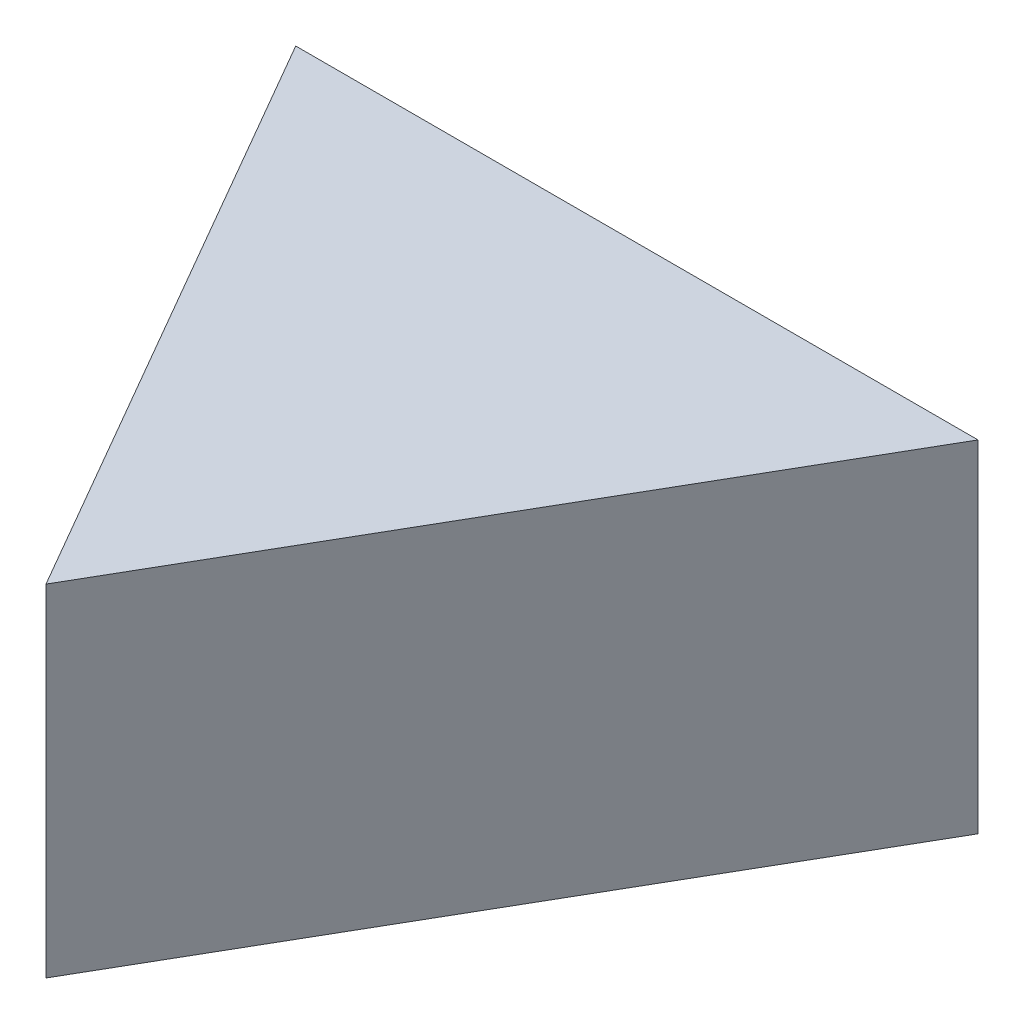
ISO-10303-21;
HEADER;
FILE_DESCRIPTION(('STEP AP214'),'2;1');
FILE_NAME('part.step','',(''),(''),'','','');
FILE_SCHEMA(('AUTOMOTIVE_DESIGN { 1 0 10303 214 1 1 1 1 }'));
ENDSEC;
DATA;
#1=APPLICATION_CONTEXT('core data for automotive mechanical design processes');
#2=APPLICATION_PROTOCOL_DEFINITION('international standard','automotive_design',2000,#1);
#3=PRODUCT_CONTEXT('',#1,'mechanical');
#4=PRODUCT('Part','Part','',(#3));
#5=PRODUCT_RELATED_PRODUCT_CATEGORY('part','',(#4));
#6=PRODUCT_DEFINITION_FORMATION('','',#4);
#7=PRODUCT_DEFINITION_CONTEXT('part definition',#1,'design');
#8=PRODUCT_DEFINITION('design','',#6,#7);
#9=PRODUCT_DEFINITION_SHAPE('','',#8);
#10=(LENGTH_UNIT() NAMED_UNIT(*) SI_UNIT(.MILLI.,.METRE.));
#11=(NAMED_UNIT(*) PLANE_ANGLE_UNIT() SI_UNIT($,.RADIAN.));
#12=(NAMED_UNIT(*) SI_UNIT($,.STERADIAN.) SOLID_ANGLE_UNIT());
#13=UNCERTAINTY_MEASURE_WITH_UNIT(LENGTH_MEASURE(1.E-05),#10,'distance_accuracy_value','');
#14=(GEOMETRIC_REPRESENTATION_CONTEXT(3) GLOBAL_UNCERTAINTY_ASSIGNED_CONTEXT((#13)) GLOBAL_UNIT_ASSIGNED_CONTEXT((#10,
#11,#12)) REPRESENTATION_CONTEXT('',''));
#15=CARTESIAN_POINT('',(0.,0.,0.));
#16=DIRECTION('',(0.,0.,1.));
#17=DIRECTION('',(1.,0.,0.));
#18=AXIS2_PLACEMENT_3D('',#15,#16,#17);
#19=CARTESIAN_POINT('',(20.,20.,0.));
#20=DIRECTION('',(-0.866025403784436,0.,-0.500000000000004));
#21=DIRECTION('',(-0.500000000000004,0.,0.866025403784436));
#22=AXIS2_PLACEMENT_3D('',#19,#20,#21);
#23=PLANE('',#22);
#24=DIRECTION('',(0.500000000000004,0.,-0.866025403784436));
#25=VECTOR('',#24,1.);
#26=CARTESIAN_POINT('',(20.,0.,0.));
#27=LINE('',#26,#25);
#28=CARTESIAN_POINT('',(0.,0.,34.6410161513772));
#29=VERTEX_POINT('',#28);
#30=CARTESIAN_POINT('',(20.,0.,0.));
#31=VERTEX_POINT('',#30);
#32=EDGE_CURVE('E89',#29,#31,#27,.T.);
#33=ORIENTED_EDGE('',*,*,#32,.T.);
#34=DIRECTION('',(0.,-1.,0.));
#35=VECTOR('',#34,1.);
#36=CARTESIAN_POINT('',(20.,20.,0.));
#37=LINE('',#36,#35);
#38=CARTESIAN_POINT('',(20.,20.,0.));
#39=VERTEX_POINT('',#38);
#40=EDGE_CURVE('E11',#39,#31,#37,.T.);
#41=ORIENTED_EDGE('',*,*,#40,.F.);
#42=DIRECTION('',(0.500000000000004,0.,-0.866025403784436));
#43=VECTOR('',#42,1.);
#44=CARTESIAN_POINT('',(20.,20.,0.));
#45=LINE('',#44,#43);
#46=CARTESIAN_POINT('',(0.,20.,34.6410161513772));
#47=VERTEX_POINT('',#46);
#48=EDGE_CURVE('E81',#47,#39,#45,.T.);
#49=ORIENTED_EDGE('',*,*,#48,.F.);
#50=DIRECTION('',(0.,-1.,0.));
#51=VECTOR('',#50,1.);
#52=CARTESIAN_POINT('',(0.,20.,34.6410161513772));
#53=LINE('',#52,#51);
#54=EDGE_CURVE('E90',#47,#29,#53,.T.);
#55=ORIENTED_EDGE('',*,*,#54,.T.);
#56=EDGE_LOOP('',(#33,#41,#49,#55));
#57=FACE_BOUND('',#56,.T.);
#58=ADVANCED_FACE('F39',(#57),#23,.F.);
#59=CARTESIAN_POINT('',(-20.,20.,0.));
#60=DIRECTION('',(0.,0.,1.));
#61=DIRECTION('',(1.,0.,0.));
#62=AXIS2_PLACEMENT_3D('',#59,#60,#61);
#63=PLANE('',#62);
#64=DIRECTION('',(-1.,0.,0.));
#65=VECTOR('',#64,1.);
#66=CARTESIAN_POINT('',(-20.,0.,0.));
#67=LINE('',#66,#65);
#68=CARTESIAN_POINT('',(-20.,0.,0.));
#69=VERTEX_POINT('',#68);
#70=EDGE_CURVE('E68',#31,#69,#67,.T.);
#71=ORIENTED_EDGE('',*,*,#70,.T.);
#72=DIRECTION('',(0.,-1.,0.));
#73=VECTOR('',#72,1.);
#74=CARTESIAN_POINT('',(-20.,20.,0.));
#75=LINE('',#74,#73);
#76=CARTESIAN_POINT('',(-20.,20.,0.));
#77=VERTEX_POINT('',#76);
#78=EDGE_CURVE('E48',#77,#69,#75,.T.);
#79=ORIENTED_EDGE('',*,*,#78,.F.);
#80=DIRECTION('',(-1.,0.,0.));
#81=VECTOR('',#80,1.);
#82=CARTESIAN_POINT('',(-20.,20.,0.));
#83=LINE('',#82,#81);
#84=EDGE_CURVE('E76',#39,#77,#83,.T.);
#85=ORIENTED_EDGE('',*,*,#84,.F.);
#86=ORIENTED_EDGE('',*,*,#40,.T.);
#87=EDGE_LOOP('',(#71,#79,#85,#86));
#88=FACE_BOUND('',#87,.T.);
#89=ADVANCED_FACE('F77',(#88),#63,.F.);
#90=CARTESIAN_POINT('',(-20.,20.,0.));
#91=DIRECTION('',(0.866025403784436,0.,-0.500000000000004));
#92=DIRECTION('',(-0.500000000000004,0.,-0.866025403784436));
#93=AXIS2_PLACEMENT_3D('',#90,#91,#92);
#94=PLANE('',#93);
#95=DIRECTION('',(0.500000000000004,0.,0.866025403784436));
#96=VECTOR('',#95,1.);
#97=CARTESIAN_POINT('',(-20.,0.,0.));
#98=LINE('',#97,#96);
#99=EDGE_CURVE('E73',#69,#29,#98,.T.);
#100=ORIENTED_EDGE('',*,*,#99,.T.);
#101=ORIENTED_EDGE('',*,*,#54,.F.);
#102=DIRECTION('',(0.500000000000004,0.,0.866025403784436));
#103=VECTOR('',#102,1.);
#104=CARTESIAN_POINT('',(-20.,20.,0.));
#105=LINE('',#104,#103);
#106=EDGE_CURVE('E56',#77,#47,#105,.T.);
#107=ORIENTED_EDGE('',*,*,#106,.F.);
#108=ORIENTED_EDGE('',*,*,#78,.T.);
#109=EDGE_LOOP('',(#100,#101,#107,#108));
#110=FACE_BOUND('',#109,.T.);
#111=ADVANCED_FACE('F102',(#110),#94,.F.);
#112=CARTESIAN_POINT('',(0.,20.,0.));
#113=DIRECTION('',(0.,1.,0.));
#114=DIRECTION('',(0.,0.,1.));
#115=AXIS2_PLACEMENT_3D('',#112,#113,#114);
#116=PLANE('',#115);
#117=ORIENTED_EDGE('',*,*,#48,.T.);
#118=ORIENTED_EDGE('',*,*,#84,.T.);
#119=ORIENTED_EDGE('',*,*,#106,.T.);
#120=EDGE_LOOP('',(#117,#118,#119));
#121=FACE_BOUND('',#120,.T.);
#122=ADVANCED_FACE('F84',(#121),#116,.T.);
#123=CARTESIAN_POINT('',(0.,0.,0.));
#124=DIRECTION('',(0.,1.,0.));
#125=DIRECTION('',(0.,0.,1.));
#126=AXIS2_PLACEMENT_3D('',#123,#124,#125);
#127=PLANE('',#126);
#128=ORIENTED_EDGE('',*,*,#32,.F.);
#129=ORIENTED_EDGE('',*,*,#99,.F.);
#130=ORIENTED_EDGE('',*,*,#70,.F.);
#131=EDGE_LOOP('',(#128,#129,#130));
#132=FACE_BOUND('',#131,.T.);
#133=ADVANCED_FACE('F103',(#132),#127,.F.);
#134=CLOSED_SHELL('',(#58,#89,#111,#122,#133));
#135=MANIFOLD_SOLID_BREP('B2',#134);
#136=ADVANCED_BREP_SHAPE_REPRESENTATION('',(#18,#135),#14);
#137=SHAPE_DEFINITION_REPRESENTATION(#9,#136);
ENDSEC;
END-ISO-10303-21;
